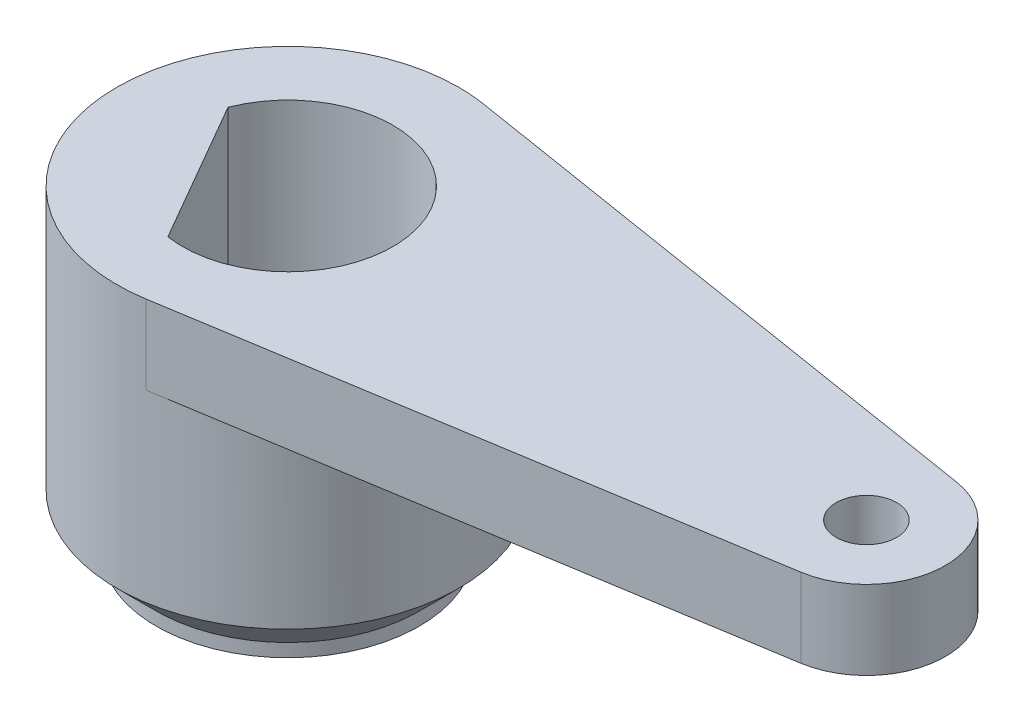
ISO-10303-21;
HEADER;
FILE_DESCRIPTION(('STEP AP214'),'2;1');
FILE_NAME('part.step','',(''),(''),'','','');
FILE_SCHEMA(('AUTOMOTIVE_DESIGN { 1 0 10303 214 1 1 1 1 }'));
ENDSEC;
DATA;
#1=APPLICATION_CONTEXT('core data for automotive mechanical design processes');
#2=APPLICATION_PROTOCOL_DEFINITION('international standard','automotive_design',2000,#1);
#3=PRODUCT_CONTEXT('',#1,'mechanical');
#4=PRODUCT('Part','Part','',(#3));
#5=PRODUCT_RELATED_PRODUCT_CATEGORY('part','',(#4));
#6=PRODUCT_DEFINITION_FORMATION('','',#4);
#7=PRODUCT_DEFINITION_CONTEXT('part definition',#1,'design');
#8=PRODUCT_DEFINITION('design','',#6,#7);
#9=PRODUCT_DEFINITION_SHAPE('','',#8);
#10=(LENGTH_UNIT() NAMED_UNIT(*) SI_UNIT(.MILLI.,.METRE.));
#11=(NAMED_UNIT(*) PLANE_ANGLE_UNIT() SI_UNIT($,.RADIAN.));
#12=(NAMED_UNIT(*) SI_UNIT($,.STERADIAN.) SOLID_ANGLE_UNIT());
#13=UNCERTAINTY_MEASURE_WITH_UNIT(LENGTH_MEASURE(1.E-05),#10,'distance_accuracy_value','');
#14=(GEOMETRIC_REPRESENTATION_CONTEXT(3) GLOBAL_UNCERTAINTY_ASSIGNED_CONTEXT((#13)) GLOBAL_UNIT_ASSIGNED_CONTEXT((#10,
#11,#12)) REPRESENTATION_CONTEXT('',''));
#15=CARTESIAN_POINT('',(0.,0.,0.));
#16=DIRECTION('',(0.,0.,1.));
#17=DIRECTION('',(1.,0.,0.));
#18=AXIS2_PLACEMENT_3D('',#15,#16,#17);
#19=CARTESIAN_POINT('',(0.,12.,0.));
#20=DIRECTION('',(0.,-1.,0.));
#21=DIRECTION('',(0.,0.,-1.));
#22=AXIS2_PLACEMENT_3D('',#19,#20,#21);
#23=CYLINDRICAL_SURFACE('',#22,4.);
#24=CARTESIAN_POINT('',(0.,0.,0.));
#25=DIRECTION('',(0.,1.,0.));
#26=DIRECTION('',(0.,0.,1.));
#27=AXIS2_PLACEMENT_3D('',#24,#25,#26);
#28=CIRCLE('',#27,4.);
#29=CARTESIAN_POINT('',(0.,0.,4.));
#30=VERTEX_POINT('',#29);
#31=EDGE_CURVE('E100',#30,#30,#28,.T.);
#32=ORIENTED_EDGE('',*,*,#31,.F.);
#33=EDGE_LOOP('',(#32));
#34=FACE_BOUND('',#33,.T.);
#35=CARTESIAN_POINT('',(0.,12.,0.));
#36=DIRECTION('',(0.,1.,0.));
#37=DIRECTION('',(0.,0.,1.));
#38=AXIS2_PLACEMENT_3D('',#35,#36,#37);
#39=CIRCLE('',#38,4.);
#40=CARTESIAN_POINT('',(-0.60381400986152,12.,3.95416345659799));
#41=VERTEX_POINT('',#40);
#42=CARTESIAN_POINT('',(-3.72631300906069,12.,-1.45416345659801));
#43=VERTEX_POINT('',#42);
#44=EDGE_CURVE('E95',#41,#43,#39,.T.);
#45=ORIENTED_EDGE('',*,*,#44,.T.);
#46=DIRECTION('',(0.,1.,0.));
#47=VECTOR('',#46,1.);
#48=CARTESIAN_POINT('',(-3.72631300906069,2.,-1.45416345659801));
#49=LINE('',#48,#47);
#50=CARTESIAN_POINT('',(-3.72631300906069,2.,-1.45416345659801));
#51=VERTEX_POINT('',#50);
#52=EDGE_CURVE('E64',#51,#43,#49,.T.);
#53=ORIENTED_EDGE('',*,*,#52,.F.);
#54=CARTESIAN_POINT('',(0.,2.,0.));
#55=DIRECTION('',(0.,1.,0.));
#56=DIRECTION('',(0.,0.,1.));
#57=AXIS2_PLACEMENT_3D('',#54,#55,#56);
#58=CIRCLE('',#57,4.);
#59=CARTESIAN_POINT('',(-0.60381400986152,2.,3.95416345659799));
#60=VERTEX_POINT('',#59);
#61=EDGE_CURVE('E59',#60,#51,#58,.F.);
#62=ORIENTED_EDGE('',*,*,#61,.F.);
#63=DIRECTION('',(0.,1.,0.));
#64=VECTOR('',#63,1.);
#65=CARTESIAN_POINT('',(-0.60381400986152,2.,3.95416345659799));
#66=LINE('',#65,#64);
#67=EDGE_CURVE('E103',#60,#41,#66,.T.);
#68=ORIENTED_EDGE('',*,*,#67,.T.);
#69=EDGE_LOOP('',(#45,#53,#62,#68));
#70=FACE_BOUND('',#69,.T.);
#71=ADVANCED_FACE('F43',(#34,#70),#23,.F.);
#72=CARTESIAN_POINT('',(0.,12.,0.));
#73=DIRECTION('',(0.,-1.,0.));
#74=DIRECTION('',(0.,0.,-1.));
#75=AXIS2_PLACEMENT_3D('',#72,#73,#74);
#76=CYLINDRICAL_SURFACE('',#75,6.5);
#77=DIRECTION('',(0.,1.,0.));
#78=VECTOR('',#77,1.);
#79=CARTESIAN_POINT('',(1.03409090909091,9.,6.41721559492399));
#80=LINE('',#79,#78);
#81=CARTESIAN_POINT('',(1.03409090909091,9.,6.41721559492399));
#82=VERTEX_POINT('',#81);
#83=CARTESIAN_POINT('',(1.03409090909091,12.,6.41721559492399));
#84=VERTEX_POINT('',#83);
#85=EDGE_CURVE('E147',#82,#84,#80,.T.);
#86=ORIENTED_EDGE('',*,*,#85,.T.);
#87=CARTESIAN_POINT('',(0.,12.,0.));
#88=DIRECTION('',(0.,1.,0.));
#89=DIRECTION('',(0.,0.,1.));
#90=AXIS2_PLACEMENT_3D('',#87,#88,#89);
#91=CIRCLE('',#90,6.5);
#92=CARTESIAN_POINT('',(1.03409090909091,12.,-6.41721559492398));
#93=VERTEX_POINT('',#92);
#94=EDGE_CURVE('E52',#93,#84,#91,.T.);
#95=ORIENTED_EDGE('',*,*,#94,.F.);
#96=DIRECTION('',(0.,1.,0.));
#97=VECTOR('',#96,1.);
#98=CARTESIAN_POINT('',(1.03409090909091,9.,-6.41721559492399));
#99=LINE('',#98,#97);
#100=CARTESIAN_POINT('',(1.03409090909091,9.,-6.41721559492399));
#101=VERTEX_POINT('',#100);
#102=EDGE_CURVE('E150',#101,#93,#99,.T.);
#103=ORIENTED_EDGE('',*,*,#102,.F.);
#104=CARTESIAN_POINT('',(0.,9.,0.));
#105=DIRECTION('',(0.,1.,0.));
#106=DIRECTION('',(0.,0.,1.));
#107=AXIS2_PLACEMENT_3D('',#104,#105,#106);
#108=CIRCLE('',#107,6.5);
#109=EDGE_CURVE('E133',#82,#101,#108,.T.);
#110=ORIENTED_EDGE('',*,*,#109,.F.);
#111=EDGE_LOOP('',(#86,#95,#103,#110));
#112=FACE_BOUND('',#111,.T.);
#113=CARTESIAN_POINT('',(0.,2.,0.));
#114=DIRECTION('',(0.,-1.,0.));
#115=DIRECTION('',(0.,0.,-1.));
#116=AXIS2_PLACEMENT_3D('',#113,#114,#115);
#117=CIRCLE('',#116,6.5);
#118=CARTESIAN_POINT('',(0.,2.,-6.5));
#119=VERTEX_POINT('',#118);
#120=EDGE_CURVE('E115',#119,#119,#117,.T.);
#121=ORIENTED_EDGE('',*,*,#120,.F.);
#122=EDGE_LOOP('',(#121));
#123=FACE_BOUND('',#122,.T.);
#124=ADVANCED_FACE('F162',(#112,#123),#76,.T.);
#125=CARTESIAN_POINT('',(0.,0.,0.));
#126=DIRECTION('',(0.,1.,0.));
#127=DIRECTION('',(0.,0.,1.));
#128=AXIS2_PLACEMENT_3D('',#125,#126,#127);
#129=PLANE('',#128);
#130=ORIENTED_EDGE('',*,*,#31,.T.);
#131=EDGE_LOOP('',(#130));
#132=FACE_BOUND('',#131,.T.);
#133=CARTESIAN_POINT('',(0.,0.,0.));
#134=DIRECTION('',(0.,-1.,0.));
#135=DIRECTION('',(0.,0.,-1.));
#136=AXIS2_PLACEMENT_3D('',#133,#134,#135);
#137=CIRCLE('',#136,5.);
#138=CARTESIAN_POINT('',(0.,0.,-5.));
#139=VERTEX_POINT('',#138);
#140=EDGE_CURVE('E106',#139,#139,#137,.T.);
#141=ORIENTED_EDGE('',*,*,#140,.T.);
#142=EDGE_LOOP('',(#141));
#143=FACE_BOUND('',#142,.T.);
#144=ADVANCED_FACE('F197',(#132,#143),#129,.F.);
#145=CARTESIAN_POINT('',(0.,12.,0.));
#146=DIRECTION('',(0.,1.,0.));
#147=DIRECTION('',(0.,0.,1.));
#148=AXIS2_PLACEMENT_3D('',#145,#146,#147);
#149=PLANE('',#148);
#150=ORIENTED_EDGE('',*,*,#94,.T.);
#151=DIRECTION('',(0.987263937680612,0.,-0.159090909090909));
#152=VECTOR('',#151,1.);
#153=CARTESIAN_POINT('',(1.03409090909091,12.,6.41721559492398));
#154=LINE('',#153,#152);
#155=CARTESIAN_POINT('',(22.4772727272727,12.,2.96179181304184));
#156=VERTEX_POINT('',#155);
#157=EDGE_CURVE('E139',#84,#156,#154,.T.);
#158=ORIENTED_EDGE('',*,*,#157,.T.);
#159=CARTESIAN_POINT('',(22.,12.,0.));
#160=DIRECTION('',(0.,1.,0.));
#161=DIRECTION('',(0.,0.,1.));
#162=AXIS2_PLACEMENT_3D('',#159,#160,#161);
#163=CIRCLE('',#162,3.);
#164=CARTESIAN_POINT('',(22.4772727272727,12.,-2.96179181304184));
#165=VERTEX_POINT('',#164);
#166=EDGE_CURVE('E142',#156,#165,#163,.T.);
#167=ORIENTED_EDGE('',*,*,#166,.T.);
#168=DIRECTION('',(0.987263937680612,0.,0.159090909090909));
#169=VECTOR('',#168,1.);
#170=CARTESIAN_POINT('',(1.03409090909091,12.,-6.41721559492398));
#171=LINE('',#170,#169);
#172=EDGE_CURVE('E125',#93,#165,#171,.T.);
#173=ORIENTED_EDGE('',*,*,#172,.F.);
#174=EDGE_LOOP('',(#150,#158,#167,#173));
#175=FACE_BOUND('',#174,.T.);
#176=ORIENTED_EDGE('',*,*,#44,.F.);
#177=DIRECTION('',(0.499999999999995,0.,0.866025403784441));
#178=VECTOR('',#177,1.);
#179=CARTESIAN_POINT('',(-2.1650635094611,12.,1.24999999999999));
#180=LINE('',#179,#178);
#181=EDGE_CURVE('E99',#43,#41,#180,.T.);
#182=ORIENTED_EDGE('',*,*,#181,.F.);
#183=EDGE_LOOP('',(#176,#182));
#184=FACE_BOUND('',#183,.T.);
#185=CARTESIAN_POINT('',(22.,12.,0.));
#186=DIRECTION('',(0.,1.,0.));
#187=DIRECTION('',(0.,0.,1.));
#188=AXIS2_PLACEMENT_3D('',#185,#186,#187);
#189=CIRCLE('',#188,1.15);
#190=CARTESIAN_POINT('',(22.,12.,1.15));
#191=VERTEX_POINT('',#190);
#192=EDGE_CURVE('E118',#191,#191,#189,.T.);
#193=ORIENTED_EDGE('',*,*,#192,.F.);
#194=EDGE_LOOP('',(#193));
#195=FACE_BOUND('',#194,.T.);
#196=ADVANCED_FACE('F96',(#175,#184,#195),#149,.T.);
#197=CARTESIAN_POINT('',(1.03409090909091,9.,6.41721559492398));
#198=DIRECTION('',(0.159090909090909,0.,0.987263937680612));
#199=DIRECTION('',(0.987263937680612,0.,-0.159090909090909));
#200=AXIS2_PLACEMENT_3D('',#197,#198,#199);
#201=PLANE('',#200);
#202=ORIENTED_EDGE('',*,*,#157,.F.);
#203=ORIENTED_EDGE('',*,*,#85,.F.);
#204=DIRECTION('',(0.987263937680612,0.,-0.159090909090909));
#205=VECTOR('',#204,1.);
#206=CARTESIAN_POINT('',(1.03409090909091,9.,6.41721559492398));
#207=LINE('',#206,#205);
#208=CARTESIAN_POINT('',(22.4772727272727,9.,2.96179181304184));
#209=VERTEX_POINT('',#208);
#210=EDGE_CURVE('E124',#82,#209,#207,.T.);
#211=ORIENTED_EDGE('',*,*,#210,.T.);
#212=DIRECTION('',(0.,1.,0.));
#213=VECTOR('',#212,1.);
#214=CARTESIAN_POINT('',(22.4772727272727,9.,2.96179181304184));
#215=LINE('',#214,#213);
#216=EDGE_CURVE('E136',#209,#156,#215,.T.);
#217=ORIENTED_EDGE('',*,*,#216,.T.);
#218=EDGE_LOOP('',(#202,#203,#211,#217));
#219=FACE_BOUND('',#218,.T.);
#220=ADVANCED_FACE('F167',(#219),#201,.T.);
#221=CARTESIAN_POINT('',(1.03409090909091,9.,-6.41721559492398));
#222=DIRECTION('',(-0.159090909090909,0.,0.987263937680612));
#223=DIRECTION('',(0.987263937680612,0.,0.159090909090909));
#224=AXIS2_PLACEMENT_3D('',#221,#222,#223);
#225=PLANE('',#224);
#226=ORIENTED_EDGE('',*,*,#172,.T.);
#227=DIRECTION('',(0.,1.,0.));
#228=VECTOR('',#227,1.);
#229=CARTESIAN_POINT('',(22.4772727272727,9.,-2.96179181304184));
#230=LINE('',#229,#228);
#231=CARTESIAN_POINT('',(22.4772727272727,9.,-2.96179181304184));
#232=VERTEX_POINT('',#231);
#233=EDGE_CURVE('E152',#232,#165,#230,.T.);
#234=ORIENTED_EDGE('',*,*,#233,.F.);
#235=DIRECTION('',(0.987263937680612,0.,0.159090909090909));
#236=VECTOR('',#235,1.);
#237=CARTESIAN_POINT('',(1.03409090909091,9.,-6.41721559492398));
#238=LINE('',#237,#236);
#239=EDGE_CURVE('E131',#101,#232,#238,.T.);
#240=ORIENTED_EDGE('',*,*,#239,.F.);
#241=ORIENTED_EDGE('',*,*,#102,.T.);
#242=EDGE_LOOP('',(#226,#234,#240,#241));
#243=FACE_BOUND('',#242,.T.);
#244=ADVANCED_FACE('F176',(#243),#225,.F.);
#245=CARTESIAN_POINT('',(22.,9.,0.));
#246=DIRECTION('',(0.,1.,0.));
#247=DIRECTION('',(0.,0.,1.));
#248=AXIS2_PLACEMENT_3D('',#245,#246,#247);
#249=CYLINDRICAL_SURFACE('',#248,1.15);
#250=CARTESIAN_POINT('',(22.,9.,0.));
#251=DIRECTION('',(0.,1.,0.));
#252=DIRECTION('',(0.,0.,1.));
#253=AXIS2_PLACEMENT_3D('',#250,#251,#252);
#254=CIRCLE('',#253,1.15);
#255=CARTESIAN_POINT('',(22.,9.,1.15));
#256=VERTEX_POINT('',#255);
#257=EDGE_CURVE('E121',#256,#256,#254,.T.);
#258=ORIENTED_EDGE('',*,*,#257,.F.);
#259=EDGE_LOOP('',(#258));
#260=FACE_BOUND('',#259,.T.);
#261=ORIENTED_EDGE('',*,*,#192,.T.);
#262=EDGE_LOOP('',(#261));
#263=FACE_BOUND('',#262,.T.);
#264=ADVANCED_FACE('F178',(#260,#263),#249,.F.);
#265=CARTESIAN_POINT('',(22.,9.,0.));
#266=DIRECTION('',(0.,1.,0.));
#267=DIRECTION('',(0.,0.,1.));
#268=AXIS2_PLACEMENT_3D('',#265,#266,#267);
#269=CYLINDRICAL_SURFACE('',#268,3.);
#270=ORIENTED_EDGE('',*,*,#166,.F.);
#271=ORIENTED_EDGE('',*,*,#216,.F.);
#272=CARTESIAN_POINT('',(22.,9.,0.));
#273=DIRECTION('',(0.,1.,0.));
#274=DIRECTION('',(0.,0.,1.));
#275=AXIS2_PLACEMENT_3D('',#272,#273,#274);
#276=CIRCLE('',#275,3.);
#277=EDGE_CURVE('E128',#209,#232,#276,.T.);
#278=ORIENTED_EDGE('',*,*,#277,.T.);
#279=ORIENTED_EDGE('',*,*,#233,.T.);
#280=EDGE_LOOP('',(#270,#271,#278,#279));
#281=FACE_BOUND('',#280,.T.);
#282=ADVANCED_FACE('F174',(#281),#269,.T.);
#283=CARTESIAN_POINT('',(0.,9.,0.));
#284=DIRECTION('',(0.,1.,0.));
#285=DIRECTION('',(0.,0.,1.));
#286=AXIS2_PLACEMENT_3D('',#283,#284,#285);
#287=PLANE('',#286);
#288=ORIENTED_EDGE('',*,*,#257,.T.);
#289=EDGE_LOOP('',(#288));
#290=FACE_BOUND('',#289,.T.);
#291=ORIENTED_EDGE('',*,*,#210,.F.);
#292=ORIENTED_EDGE('',*,*,#109,.T.);
#293=ORIENTED_EDGE('',*,*,#239,.T.);
#294=ORIENTED_EDGE('',*,*,#277,.F.);
#295=EDGE_LOOP('',(#291,#292,#293,#294));
#296=FACE_BOUND('',#295,.T.);
#297=ADVANCED_FACE('F170',(#290,#296),#287,.F.);
#298=CARTESIAN_POINT('',(0.,2.,0.));
#299=DIRECTION('',(0.,-1.,0.));
#300=DIRECTION('',(0.,0.,-1.));
#301=AXIS2_PLACEMENT_3D('',#298,#299,#300);
#302=CYLINDRICAL_SURFACE('',#301,5.);
#303=CARTESIAN_POINT('',(0.,0.499999999999991,0.));
#304=DIRECTION('',(0.,-1.,0.));
#305=DIRECTION('',(0.,0.,-1.));
#306=AXIS2_PLACEMENT_3D('',#303,#304,#305);
#307=CIRCLE('',#306,5.);
#308=CARTESIAN_POINT('',(0.,0.499999999999991,-5.));
#309=VERTEX_POINT('',#308);
#310=EDGE_CURVE('E11',#309,#309,#307,.T.);
#311=ORIENTED_EDGE('',*,*,#310,.T.);
#312=EDGE_LOOP('',(#311));
#313=FACE_BOUND('',#312,.T.);
#314=ORIENTED_EDGE('',*,*,#140,.F.);
#315=EDGE_LOOP('',(#314));
#316=FACE_BOUND('',#315,.T.);
#317=ADVANCED_FACE('F207',(#313,#316),#302,.T.);
#318=CARTESIAN_POINT('',(-2.1650635094611,2.,1.24999999999999));
#319=DIRECTION('',(-0.866025403784441,0.,0.499999999999995));
#320=DIRECTION('',(0.499999999999995,0.,0.866025403784441));
#321=AXIS2_PLACEMENT_3D('',#318,#319,#320);
#322=PLANE('',#321);
#323=ORIENTED_EDGE('',*,*,#181,.T.);
#324=ORIENTED_EDGE('',*,*,#67,.F.);
#325=DIRECTION('',(0.499999999999995,0.,0.866025403784441));
#326=VECTOR('',#325,1.);
#327=CARTESIAN_POINT('',(-2.1650635094611,2.,1.24999999999999));
#328=LINE('',#327,#326);
#329=EDGE_CURVE('E109',#51,#60,#328,.T.);
#330=ORIENTED_EDGE('',*,*,#329,.F.);
#331=ORIENTED_EDGE('',*,*,#52,.T.);
#332=EDGE_LOOP('',(#323,#324,#330,#331));
#333=FACE_BOUND('',#332,.T.);
#334=ADVANCED_FACE('F108',(#333),#322,.F.);
#335=CARTESIAN_POINT('',(0.,2.,0.));
#336=DIRECTION('',(0.,1.,0.));
#337=DIRECTION('',(0.,0.,1.));
#338=AXIS2_PLACEMENT_3D('',#335,#336,#337);
#339=PLANE('',#338);
#340=ORIENTED_EDGE('',*,*,#329,.T.);
#341=ORIENTED_EDGE('',*,*,#61,.T.);
#342=EDGE_LOOP('',(#340,#341));
#343=FACE_BOUND('',#342,.T.);
#344=ADVANCED_FACE('F216',(#343),#339,.F.);
#345=CARTESIAN_POINT('',(0.,0.499999999999991,0.));
#346=DIRECTION('',(0.,1.,0.));
#347=DIRECTION('',(0.,0.,1.));
#348=AXIS2_PLACEMENT_3D('',#345,#346,#347);
#349=CONICAL_SURFACE('',#348,5.,0.785398163397444);
#350=ORIENTED_EDGE('',*,*,#120,.T.);
#351=EDGE_LOOP('',(#350));
#352=FACE_BOUND('',#351,.T.);
#353=ORIENTED_EDGE('',*,*,#310,.F.);
#354=EDGE_LOOP('',(#353));
#355=FACE_BOUND('',#354,.T.);
#356=ADVANCED_FACE('F46',(#352,#355),#349,.T.);
#357=CLOSED_SHELL('',(#71,#124,#144,#196,#220,#244,#264,#282,#297,#317,#334,#344,#356));
#358=MANIFOLD_SOLID_BREP('B2',#357);
#359=ADVANCED_BREP_SHAPE_REPRESENTATION('',(#18,#358),#14);
#360=SHAPE_DEFINITION_REPRESENTATION(#9,#359);
ENDSEC;
END-ISO-10303-21;
